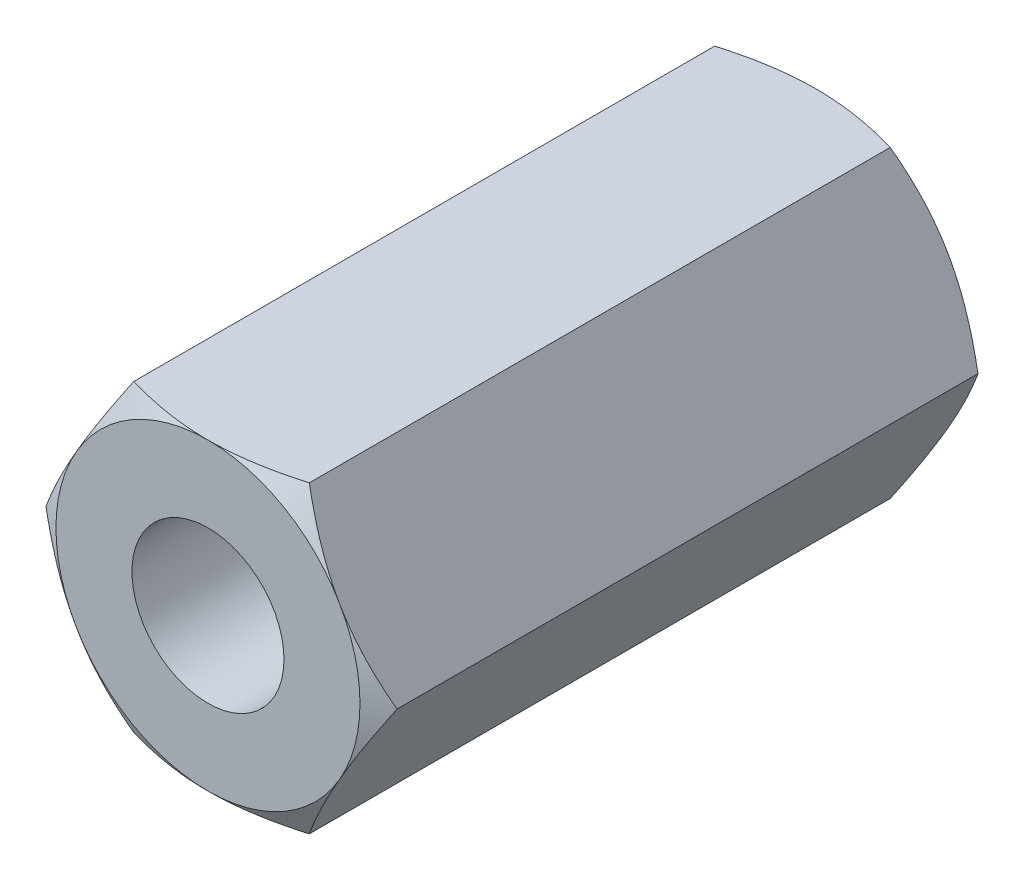
ISO-10303-21;
HEADER;
FILE_DESCRIPTION(('STEP AP214'),'2;1');
FILE_NAME('part.step','',(''),(''),'','','');
FILE_SCHEMA(('AUTOMOTIVE_DESIGN { 1 0 10303 214 1 1 1 1 }'));
ENDSEC;
DATA;
#1=APPLICATION_CONTEXT('core data for automotive mechanical design processes');
#2=APPLICATION_PROTOCOL_DEFINITION('international standard','automotive_design',2000,#1);
#3=PRODUCT_CONTEXT('',#1,'mechanical');
#4=PRODUCT('Part','Part','',(#3));
#5=PRODUCT_RELATED_PRODUCT_CATEGORY('part','',(#4));
#6=PRODUCT_DEFINITION_FORMATION('','',#4);
#7=PRODUCT_DEFINITION_CONTEXT('part definition',#1,'design');
#8=PRODUCT_DEFINITION('design','',#6,#7);
#9=PRODUCT_DEFINITION_SHAPE('','',#8);
#10=(LENGTH_UNIT() NAMED_UNIT(*) SI_UNIT(.MILLI.,.METRE.));
#11=(NAMED_UNIT(*) PLANE_ANGLE_UNIT() SI_UNIT($,.RADIAN.));
#12=(NAMED_UNIT(*) SI_UNIT($,.STERADIAN.) SOLID_ANGLE_UNIT());
#13=UNCERTAINTY_MEASURE_WITH_UNIT(LENGTH_MEASURE(1.E-05),#10,'distance_accuracy_value','');
#14=(GEOMETRIC_REPRESENTATION_CONTEXT(3) GLOBAL_UNCERTAINTY_ASSIGNED_CONTEXT((#13)) GLOBAL_UNIT_ASSIGNED_CONTEXT((#10,
#11,#12)) REPRESENTATION_CONTEXT('',''));
#15=CARTESIAN_POINT('',(0.,0.,0.));
#16=DIRECTION('',(0.,0.,1.));
#17=DIRECTION('',(1.,0.,0.));
#18=AXIS2_PLACEMENT_3D('',#15,#16,#17);
#19=CARTESIAN_POINT('',(0.,0.,5.56698729810778));
#20=DIRECTION('',(0.,0.,-1.));
#21=DIRECTION('',(0.,1.,0.));
#22=AXIS2_PLACEMENT_3D('',#19,#20,#21);
#23=CONICAL_SURFACE('',#22,3.75,1.0471975511966);
#24=CARTESIAN_POINT('',(-4.61658816560313,-3.,4.55332536641132));
#25=CARTESIAN_POINT('',(-4.48585639553745,-3.,4.61659673599052));
#26=CARTESIAN_POINT('',(-4.35482063299639,-3.,4.67925095047082));
#27=CARTESIAN_POINT('',(-4.09197932362654,-3.,4.80297722697862));
#28=CARTESIAN_POINT('',(-3.96017365610342,-3.,4.86404903231273));
#29=CARTESIAN_POINT('',(-3.69493421662757,-3.,4.98457763911744));
#30=CARTESIAN_POINT('',(-3.56149546306723,-3.,5.04402351646837));
#31=CARTESIAN_POINT('',(-3.29354397999658,-3.,5.16043407504241));
#32=CARTESIAN_POINT('',(-3.15903130268234,-3.,5.21739887599533));
#33=CARTESIAN_POINT('',(-2.88451486663867,-3.,5.32991377331616));
#34=CARTESIAN_POINT('',(-2.74447033709531,-3.,5.38536494839728));
#35=CARTESIAN_POINT('',(-2.46272959449536,-3.,5.49198287179878));
#36=CARTESIAN_POINT('',(-2.32103319621333,-3.,5.54314913428037));
#37=CARTESIAN_POINT('',(-2.03604039609872,-3.,5.63982761977302));
#38=CARTESIAN_POINT('',(-1.89274802630187,-3.,5.68535160726105));
#39=CARTESIAN_POINT('',(-1.60410836835444,-3.,5.76926106967255));
#40=CARTESIAN_POINT('',(-1.45876175465369,-3.,5.8076488315534));
#41=CARTESIAN_POINT('',(-1.16673215848061,-3.,5.8752176455911));
#42=CARTESIAN_POINT('',(-1.0200606408196,-3.,5.90444732518244));
#43=CARTESIAN_POINT('',(-0.724931883390046,-3.,5.95202353955565));
#44=CARTESIAN_POINT('',(-0.576474802153951,-3.,5.97037103334759));
#45=CARTESIAN_POINT('',(-0.280440052185822,-3.,5.99447833561648));
#46=CARTESIAN_POINT('',(-0.13287565270878,-3.,6.00039709755714));
#47=CARTESIAN_POINT('',(0.162228239904156,-3.,5.99956145014694));
#48=CARTESIAN_POINT('',(0.309767732325289,-3.,5.99280672401251));
#49=CARTESIAN_POINT('',(0.56132805962686,-3.,5.9709572819287));
#50=CARTESIAN_POINT('',(0.665621803419395,-3.,5.95883150506769));
#51=CARTESIAN_POINT('',(0.873419518980608,-3.,5.92902216036775));
#52=CARTESIAN_POINT('',(0.976923376822562,-3.,5.91133780576261));
#53=CARTESIAN_POINT('',(1.28611373532515,-3.,5.85087645938643));
#54=CARTESIAN_POINT('',(1.49035730083079,-3.,5.80070312750081));
#55=CARTESIAN_POINT('',(1.89902764143582,-3.,5.68479281504696));
#56=CARTESIAN_POINT('',(2.10336150492194,-3.,5.61874063547991));
#57=CARTESIAN_POINT('',(2.40703442855808,-3.,5.51188270244431));
#58=CARTESIAN_POINT('',(2.50777604457203,-3.,5.47497145514699));
#59=CARTESIAN_POINT('',(2.7084324429228,-3.,5.39896563915211));
#60=CARTESIAN_POINT('',(2.80834723318007,-3.,5.35987109139702));
#61=CARTESIAN_POINT('',(3.03652654486058,-3.,5.26818150264062));
#62=CARTESIAN_POINT('',(3.16454614650239,-3.,5.21497889029494));
#63=CARTESIAN_POINT('',(3.41955503261441,-3.,5.10615379179428));
#64=CARTESIAN_POINT('',(3.54654426752983,-3.,5.05053119006048));
#65=CARTESIAN_POINT('',(3.92625860423041,-3.,4.88075275505402));
#66=CARTESIAN_POINT('',(4.17768851165822,-3.,4.76370348434465));
#67=CARTESIAN_POINT('',(4.67831517527856,-3.,4.52440154372504));
#68=CARTESIAN_POINT('',(4.92750969345666,-3.,4.40214424003166));
#69=CARTESIAN_POINT('',(5.42413001849477,-3.,4.15407673717374));
#70=CARTESIAN_POINT('',(5.67155576558937,-3.,4.02826641866));
#71=CARTESIAN_POINT('',(6.14562883300115,-3.,3.78413020470005));
#72=CARTESIAN_POINT('',(6.37237560034691,-3.,3.66599677644138));
#73=CARTESIAN_POINT('',(6.8250176751701,-3.,3.42809509619585));
#74=CARTESIAN_POINT('',(7.05091295673014,-3.,3.30832679495165));
#75=CARTESIAN_POINT('',(7.50152538445931,-3.,3.06780728554477));
#76=CARTESIAN_POINT('',(7.72624403806943,-3.,2.94705889743176));
#77=CARTESIAN_POINT('',(8.17513206085804,-3.,2.70457171012414));
#78=CARTESIAN_POINT('',(8.39930145695651,-3.,2.58283296078537));
#79=CARTESIAN_POINT('',(8.62326645922438,-3.,2.46072192935785));
#80=B_SPLINE_CURVE_WITH_KNOTS('',3,(#24,#25,#26,#27,#28,#29,#30,#31,#32,#33,#34,#35,#36,#37,#38,
#39,#40,#41,#42,#43,#44,#45,#46,#47,#48,#49,#50,#51,#52,#53,#54,#55,#56,#57,#58,#59,#60,#61,#62,
#63,#64,#65,#66,#67,#68,#69,#70,#71,#72,#73,#74,#75,#76,#77,#78,#79),.UNSPECIFIED.,.F.,.F.,(4,2,
2,2,2,2,2,2,2,2,2,2,2,2,2,2,2,2,2,2,2,2,2,2,2,2,2,4),(0.,0.435719350665182,0.871508945355478,
1.30973230306221,1.74793448985021,2.19974947235604,2.65161561410331,3.10252314515071,
3.55328592310448,4.00161301376219,4.4499005890032,4.8924191110649,5.3349486943642,
5.64978531479406,5.96466651757124,6.59479413668654,7.2386470362871,7.56049974594028,
7.88234936887596,8.29822097415706,8.71411246333825,9.54603104088751,10.3787059339167,
11.2114088306492,11.9784254401204,12.7454652103875,13.5107780415065,14.2760525814872),.UNSPECIFIED.);
#81=CARTESIAN_POINT('',(1.73205080756888,-3.,5.73205080756888));
#82=VERTEX_POINT('',#81);
#83=CARTESIAN_POINT('',(0.,-3.,6.));
#84=VERTEX_POINT('',#83);
#85=EDGE_CURVE('E227',#82,#84,#80,.F.);
#86=ORIENTED_EDGE('',*,*,#85,.F.);
#87=CARTESIAN_POINT('',(3.46421708519159,0.00019999999999997,5.73198413756899));
#88=CARTESIAN_POINT('',(3.38810199317915,-0.131635206588332,5.77594629554769));
#89=CARTESIAN_POINT('',(3.31132988107606,-0.26460840535525,5.81592841370737));
#90=CARTESIAN_POINT('',(3.15645624025988,-0.532857420002056,5.88571791955453));
#91=CARTESIAN_POINT('',(3.078351959461,-0.668138002634342,5.91550061773462));
#92=CARTESIAN_POINT('',(2.92311136358059,-0.937022602096484,5.96186216078875));
#93=CARTESIAN_POINT('',(2.84599893549861,-1.07058524542946,5.97874955887705));
#94=CARTESIAN_POINT('',(2.6914112001411,-1.33833905729569,5.99891035755148));
#95=CARTESIAN_POINT('',(2.61393645482892,-1.47252925247984,6.00220045221892));
#96=CARTESIAN_POINT('',(2.46916798492017,-1.72327559769581,5.99535946911461));
#97=CARTESIAN_POINT('',(2.40185259973206,-1.83986926497268,5.98690808580738));
#98=CARTESIAN_POINT('',(2.2676603930218,-2.07229698497464,5.96012105699297));
#99=CARTESIAN_POINT('',(2.2007840357172,-2.18813023365133,5.94177625913829));
#100=CARTESIAN_POINT('',(2.06631510305815,-2.42103725705637,5.89591524914667));
#101=CARTESIAN_POINT('',(1.99873954872331,-2.53808155051394,5.86820461473692));
#102=CARTESIAN_POINT('',(1.86459637060759,-2.77042435049912,5.8053122048626));
#103=CARTESIAN_POINT('',(1.79802702797161,-2.88572583417111,5.77014520897844));
#104=CARTESIAN_POINT('',(1.73193533751504,-3.0002,5.73198413756899));
#105=B_SPLINE_CURVE_WITH_KNOTS('',3,(#87,#88,#89,#90,#91,#92,#93,#94,#95,#96,#97,#98,#99,#100,
#101,#102,#103,#104),.UNSPECIFIED.,.F.,.F.,(4,2,2,2,2,2,2,2,4),(0.,0.475539830103042,
0.952222784107966,1.41710776961288,1.88142182298026,2.28572436316091,2.69040156475039,
3.10405572063576,3.5168974940707),.UNSPECIFIED.);
#106=CARTESIAN_POINT('',(2.59807621135332,-1.5,6.));
#107=VERTEX_POINT('',#106);
#108=EDGE_CURVE('E156',#107,#82,#105,.T.);
#109=ORIENTED_EDGE('',*,*,#108,.F.);
#110=CARTESIAN_POINT('',(0.,0.,6.));
#111=DIRECTION('',(0.,0.,1.));
#112=DIRECTION('',(0.,-1.,0.));
#113=AXIS2_PLACEMENT_3D('',#110,#111,#112);
#114=CIRCLE('',#113,3.);
#115=EDGE_CURVE('E12',#84,#107,#114,.T.);
#116=ORIENTED_EDGE('',*,*,#115,.F.);
#117=EDGE_LOOP('',(#86,#109,#116));
#118=FACE_BOUND('',#117,.T.);
#119=ADVANCED_FACE('F37',(#118),#23,.T.);
#120=CARTESIAN_POINT('',(-1.73205080756888,-3.,5.73205080756888));
#121=VERTEX_POINT('',#120);
#122=EDGE_CURVE('E232',#84,#121,#80,.F.);
#123=ORIENTED_EDGE('',*,*,#122,.F.);
#124=CARTESIAN_POINT('',(-2.59807621135332,-1.5,6.));
#125=VERTEX_POINT('',#124);
#126=EDGE_CURVE('E46',#125,#84,#114,.T.);
#127=ORIENTED_EDGE('',*,*,#126,.F.);
#128=CARTESIAN_POINT('',(-1.73193533751504,-3.0002,5.73198413756899));
#129=CARTESIAN_POINT('',(-1.80805042952748,-2.86836479341167,5.77594629554769));
#130=CARTESIAN_POINT('',(-1.88482254163057,-2.73539159464475,5.81592841370737));
#131=CARTESIAN_POINT('',(-2.03969618244675,-2.46714257999794,5.88571791955454));
#132=CARTESIAN_POINT('',(-2.11780046324563,-2.33186199736566,5.91550061773462));
#133=CARTESIAN_POINT('',(-2.27304105912605,-2.06297739790352,5.96186216078874));
#134=CARTESIAN_POINT('',(-2.35015348720802,-1.92941475457054,5.97874955887705));
#135=CARTESIAN_POINT('',(-2.50474122256554,-1.66166094270431,5.99891035755148));
#136=CARTESIAN_POINT('',(-2.58221596787771,-1.52747074752016,6.00220045221892));
#137=CARTESIAN_POINT('',(-2.72698443778647,-1.27672440230419,5.99535946911461));
#138=CARTESIAN_POINT('',(-2.79429982297457,-1.16013073502732,5.98690808580738));
#139=CARTESIAN_POINT('',(-2.92849202968483,-0.927703015025363,5.96012105699297));
#140=CARTESIAN_POINT('',(-2.99536838698943,-0.811869766348668,5.94177625913829));
#141=CARTESIAN_POINT('',(-3.12983731964848,-0.578962742943632,5.89591524914667));
#142=CARTESIAN_POINT('',(-3.19741287398332,-0.461918449486059,5.86820461473692));
#143=CARTESIAN_POINT('',(-3.33155605209904,-0.229575649500875,5.8053122048626));
#144=CARTESIAN_POINT('',(-3.39812539473502,-0.114274165828894,5.77014520897844));
#145=CARTESIAN_POINT('',(-3.46421708519159,0.000199999999999855,5.73198413756899));
#146=B_SPLINE_CURVE_WITH_KNOTS('',3,(#128,#129,#130,#131,#132,#133,#134,#135,#136,#137,#138,
#139,#140,#141,#142,#143,#144,#145),.UNSPECIFIED.,.F.,.F.,(4,2,2,2,2,2,2,2,4),(0.,
0.475539830103041,0.952222784107965,1.41710776961288,1.88142182298026,2.28572436316091,
2.69040156475039,3.10405572063576,3.5168974940707),.UNSPECIFIED.);
#147=EDGE_CURVE('E273',#121,#125,#146,.T.);
#148=ORIENTED_EDGE('',*,*,#147,.F.);
#149=EDGE_LOOP('',(#123,#127,#148));
#150=FACE_BOUND('',#149,.T.);
#151=ADVANCED_FACE('F248',(#150),#23,.T.);
#152=CARTESIAN_POINT('',(-3.46410161513775,0.,5.73205080756888));
#153=VERTEX_POINT('',#152);
#154=EDGE_CURVE('E268',#125,#153,#146,.T.);
#155=ORIENTED_EDGE('',*,*,#154,.F.);
#156=CARTESIAN_POINT('',(-2.59807621135332,1.5,6.));
#157=VERTEX_POINT('',#156);
#158=EDGE_CURVE('E223',#157,#125,#114,.T.);
#159=ORIENTED_EDGE('',*,*,#158,.F.);
#160=CARTESIAN_POINT('',(-3.46421708519159,-0.0002,5.73198413756899));
#161=CARTESIAN_POINT('',(-3.38810199317915,0.131635206588332,5.77594629554769));
#162=CARTESIAN_POINT('',(-3.31132988107606,0.26460840535525,5.81592841370737));
#163=CARTESIAN_POINT('',(-3.15645624025988,0.532857420002056,5.88571791955453));
#164=CARTESIAN_POINT('',(-3.078351959461,0.668138002634342,5.91550061773462));
#165=CARTESIAN_POINT('',(-2.92311136358059,0.937022602096484,5.96186216078875));
#166=CARTESIAN_POINT('',(-2.84599893549861,1.07058524542946,5.97874955887705));
#167=CARTESIAN_POINT('',(-2.6914112001411,1.33833905729569,5.99891035755148));
#168=CARTESIAN_POINT('',(-2.61393645482892,1.47252925247984,6.00220045221892));
#169=CARTESIAN_POINT('',(-2.46916798492017,1.72327559769581,5.99535946911461));
#170=CARTESIAN_POINT('',(-2.40185259973206,1.83986926497268,5.98690808580738));
#171=CARTESIAN_POINT('',(-2.2676603930218,2.07229698497464,5.96012105699297));
#172=CARTESIAN_POINT('',(-2.2007840357172,2.18813023365133,5.94177625913829));
#173=CARTESIAN_POINT('',(-2.06631510305815,2.42103725705637,5.89591524914667));
#174=CARTESIAN_POINT('',(-1.99873954872331,2.53808155051394,5.86820461473692));
#175=CARTESIAN_POINT('',(-1.86459637060759,2.77042435049913,5.8053122048626));
#176=CARTESIAN_POINT('',(-1.79802702797161,2.88572583417111,5.77014520897844));
#177=CARTESIAN_POINT('',(-1.73193533751504,3.0002,5.73198413756899));
#178=B_SPLINE_CURVE_WITH_KNOTS('',3,(#160,#161,#162,#163,#164,#165,#166,#167,#168,#169,#170,
#171,#172,#173,#174,#175,#176,#177),.UNSPECIFIED.,.F.,.F.,(4,2,2,2,2,2,2,2,4),(0.,
0.475539830103041,0.952222784107965,1.41710776961288,1.88142182298026,2.28572436316091,
2.69040156475039,3.10405572063576,3.5168974940707),.UNSPECIFIED.);
#179=EDGE_CURVE('E334',#153,#157,#178,.T.);
#180=ORIENTED_EDGE('',*,*,#179,.F.);
#181=EDGE_LOOP('',(#155,#159,#180));
#182=FACE_BOUND('',#181,.T.);
#183=ADVANCED_FACE('F333',(#182),#23,.T.);
#184=CARTESIAN_POINT('',(-1.73205080756888,3.,5.73205080756888));
#185=VERTEX_POINT('',#184);
#186=EDGE_CURVE('E263',#157,#185,#178,.T.);
#187=ORIENTED_EDGE('',*,*,#186,.F.);
#188=CARTESIAN_POINT('',(0.,3.,6.));
#189=VERTEX_POINT('',#188);
#190=EDGE_CURVE('E322',#189,#157,#114,.T.);
#191=ORIENTED_EDGE('',*,*,#190,.F.);
#192=CARTESIAN_POINT('',(-4.61658816560314,3.,4.55332536641131));
#193=CARTESIAN_POINT('',(-4.48585639553746,3.,4.61659673599051));
#194=CARTESIAN_POINT('',(-4.3548206329964,3.,4.67925095047082));
#195=CARTESIAN_POINT('',(-4.09197932362655,3.,4.80297722697862));
#196=CARTESIAN_POINT('',(-3.96017365610343,3.,4.86404903231273));
#197=CARTESIAN_POINT('',(-3.69493421662757,3.,4.98457763911744));
#198=CARTESIAN_POINT('',(-3.56149546306723,3.,5.04402351646837));
#199=CARTESIAN_POINT('',(-3.29354397999658,3.,5.16043407504241));
#200=CARTESIAN_POINT('',(-3.15903130268234,3.,5.21739887599533));
#201=CARTESIAN_POINT('',(-2.88451486663867,3.,5.32991377331615));
#202=CARTESIAN_POINT('',(-2.74447033709531,3.,5.38536494839728));
#203=CARTESIAN_POINT('',(-2.46272959449536,3.,5.49198287179878));
#204=CARTESIAN_POINT('',(-2.32103319621333,3.,5.54314913428037));
#205=CARTESIAN_POINT('',(-2.03604039609872,3.,5.63982761977302));
#206=CARTESIAN_POINT('',(-1.89274802630187,3.,5.68535160726105));
#207=CARTESIAN_POINT('',(-1.60410836835444,3.,5.76926106967255));
#208=CARTESIAN_POINT('',(-1.45876175465369,3.,5.8076488315534));
#209=CARTESIAN_POINT('',(-1.16673215848061,3.,5.8752176455911));
#210=CARTESIAN_POINT('',(-1.0200606408196,3.,5.90444732518244));
#211=CARTESIAN_POINT('',(-0.724931883390045,3.,5.95202353955565));
#212=CARTESIAN_POINT('',(-0.576474802153949,3.,5.97037103334759));
#213=CARTESIAN_POINT('',(-0.28044005218582,3.,5.99447833561648));
#214=CARTESIAN_POINT('',(-0.132875652708778,3.,6.00039709755714));
#215=CARTESIAN_POINT('',(0.162228239904158,3.,5.99956145014694));
#216=CARTESIAN_POINT('',(0.309767732325292,3.,5.99280672401251));
#217=CARTESIAN_POINT('',(0.561328059626863,3.,5.97095728192869));
#218=CARTESIAN_POINT('',(0.665621803419398,3.,5.95883150506769));
#219=CARTESIAN_POINT('',(0.873419518980611,3.,5.92902216036775));
#220=CARTESIAN_POINT('',(0.976923376822566,3.,5.9113378057626));
#221=CARTESIAN_POINT('',(1.28611373532515,3.,5.85087645938643));
#222=CARTESIAN_POINT('',(1.49035730083079,3.,5.80070312750081));
#223=CARTESIAN_POINT('',(1.89902764143583,3.,5.68479281504695));
#224=CARTESIAN_POINT('',(2.10336150492195,3.,5.6187406354799));
#225=CARTESIAN_POINT('',(2.40703442855809,3.,5.5118827024443));
#226=CARTESIAN_POINT('',(2.50777604457204,3.,5.47497145514699));
#227=CARTESIAN_POINT('',(2.70843244292281,3.,5.39896563915211));
#228=CARTESIAN_POINT('',(2.80834723318008,3.,5.35987109139702));
#229=CARTESIAN_POINT('',(3.03652654486058,3.,5.26818150264061));
#230=CARTESIAN_POINT('',(3.16454614650239,3.,5.21497889029493));
#231=CARTESIAN_POINT('',(3.41955503261442,3.,5.10615379179428));
#232=CARTESIAN_POINT('',(3.54654426752983,3.,5.05053119006048));
#233=CARTESIAN_POINT('',(3.92625860423042,3.,4.88075275505402));
#234=CARTESIAN_POINT('',(4.17768851165823,3.,4.76370348434465));
#235=CARTESIAN_POINT('',(4.67831517527857,3.,4.52440154372503));
#236=CARTESIAN_POINT('',(4.92750969345666,3.,4.40214424003165));
#237=CARTESIAN_POINT('',(5.42413001849477,3.,4.15407673717374));
#238=CARTESIAN_POINT('',(5.67155576558938,3.,4.02826641865999));
#239=CARTESIAN_POINT('',(6.14562883300116,3.,3.78413020470004));
#240=CARTESIAN_POINT('',(6.37237560034691,3.,3.66599677644137));
#241=CARTESIAN_POINT('',(6.8250176751701,3.,3.42809509619585));
#242=CARTESIAN_POINT('',(7.05091295673015,3.,3.30832679495164));
#243=CARTESIAN_POINT('',(7.50152538445932,3.,3.06780728554477));
#244=CARTESIAN_POINT('',(7.72624403806943,3.,2.94705889743175));
#245=CARTESIAN_POINT('',(8.17513206085804,3.,2.70457171012414));
#246=CARTESIAN_POINT('',(8.39930145695651,3.,2.58283296078537));
#247=CARTESIAN_POINT('',(8.62326645922439,3.,2.46072192935785));
#248=B_SPLINE_CURVE_WITH_KNOTS('',3,(#192,#193,#194,#195,#196,#197,#198,#199,#200,#201,#202,
#203,#204,#205,#206,#207,#208,#209,#210,#211,#212,#213,#214,#215,#216,#217,#218,#219,#220,#221,
#222,#223,#224,#225,#226,#227,#228,#229,#230,#231,#232,#233,#234,#235,#236,#237,#238,#239,#240,
#241,#242,#243,#244,#245,#246,#247),.UNSPECIFIED.,.F.,.F.,(4,2,2,2,2,2,2,2,2,2,2,2,2,2,2,2,2,2,
2,2,2,2,2,2,2,2,2,4),(0.,0.435719350665182,0.871508945355478,1.30973230306221,1.74793448985021,
2.19974947235604,2.65161561410331,3.10252314515072,3.55328592310448,4.00161301376219,
4.4499005890032,4.8924191110649,5.33494869436421,5.64978531479407,5.96466651757125,
6.59479413668655,7.23864703628711,7.56049974594029,7.88234936887598,8.29822097415707,
8.71411246333826,9.54603104088752,10.3787059339167,11.2114088306492,11.9784254401204,
12.7454652103875,13.5107780415065,14.2760525814872),.UNSPECIFIED.);
#249=EDGE_CURVE('E295',#185,#189,#248,.T.);
#250=ORIENTED_EDGE('',*,*,#249,.F.);
#251=EDGE_LOOP('',(#187,#191,#250));
#252=FACE_BOUND('',#251,.T.);
#253=ADVANCED_FACE('F337',(#252),#23,.T.);
#254=CARTESIAN_POINT('',(1.73205080756888,3.,5.73205080756888));
#255=VERTEX_POINT('',#254);
#256=EDGE_CURVE('E257',#189,#255,#248,.T.);
#257=ORIENTED_EDGE('',*,*,#256,.F.);
#258=CARTESIAN_POINT('',(2.59807621135332,1.5,6.));
#259=VERTEX_POINT('',#258);
#260=EDGE_CURVE('E317',#259,#189,#114,.T.);
#261=ORIENTED_EDGE('',*,*,#260,.F.);
#262=CARTESIAN_POINT('',(1.73193533751504,3.0002,5.73198413756899));
#263=CARTESIAN_POINT('',(1.80805042952748,2.86836479341167,5.77594629554769));
#264=CARTESIAN_POINT('',(1.88482254163057,2.73539159464475,5.81592841370737));
#265=CARTESIAN_POINT('',(2.03969618244675,2.46714257999794,5.88571791955453));
#266=CARTESIAN_POINT('',(2.11780046324563,2.33186199736566,5.91550061773462));
#267=CARTESIAN_POINT('',(2.27304105912605,2.06297739790352,5.96186216078874));
#268=CARTESIAN_POINT('',(2.35015348720802,1.92941475457054,5.97874955887705));
#269=CARTESIAN_POINT('',(2.50474122256554,1.66166094270431,5.99891035755148));
#270=CARTESIAN_POINT('',(2.58221596787771,1.52747074752016,6.00220045221892));
#271=CARTESIAN_POINT('',(2.72698443778647,1.27672440230419,5.99535946911461));
#272=CARTESIAN_POINT('',(2.79429982297457,1.16013073502732,5.98690808580738));
#273=CARTESIAN_POINT('',(2.92849202968483,0.927703015025362,5.96012105699297));
#274=CARTESIAN_POINT('',(2.99536838698943,0.811869766348667,5.94177625913829));
#275=CARTESIAN_POINT('',(3.12983731964849,0.578962742943631,5.89591524914667));
#276=CARTESIAN_POINT('',(3.19741287398332,0.461918449486059,5.86820461473692));
#277=CARTESIAN_POINT('',(3.33155605209904,0.229575649500875,5.8053122048626));
#278=CARTESIAN_POINT('',(3.39812539473502,0.114274165828893,5.77014520897844));
#279=CARTESIAN_POINT('',(3.46421708519159,-0.000200000000000225,5.73198413756899));
#280=B_SPLINE_CURVE_WITH_KNOTS('',3,(#262,#263,#264,#265,#266,#267,#268,#269,#270,#271,#272,
#273,#274,#275,#276,#277,#278,#279),.UNSPECIFIED.,.F.,.F.,(4,2,2,2,2,2,2,2,4),(0.,
0.475539830103041,0.952222784107966,1.41710776961288,1.88142182298026,2.28572436316091,
2.69040156475039,3.10405572063576,3.5168974940707),.UNSPECIFIED.);
#281=EDGE_CURVE('E148',#255,#259,#280,.T.);
#282=ORIENTED_EDGE('',*,*,#281,.F.);
#283=EDGE_LOOP('',(#257,#261,#282));
#284=FACE_BOUND('',#283,.T.);
#285=ADVANCED_FACE('F318',(#284),#23,.T.);
#286=CARTESIAN_POINT('',(3.46410161513775,0.,5.73205080756888));
#287=VERTEX_POINT('',#286);
#288=EDGE_CURVE('E140',#259,#287,#280,.T.);
#289=ORIENTED_EDGE('',*,*,#288,.F.);
#290=EDGE_CURVE('E45',#107,#259,#114,.T.);
#291=ORIENTED_EDGE('',*,*,#290,.F.);
#292=EDGE_CURVE('E53',#287,#107,#105,.T.);
#293=ORIENTED_EDGE('',*,*,#292,.F.);
#294=EDGE_LOOP('',(#289,#291,#293));
#295=FACE_BOUND('',#294,.T.);
#296=ADVANCED_FACE('F250',(#295),#23,.T.);
#297=CARTESIAN_POINT('',(0.,0.,6.));
#298=DIRECTION('',(0.,0.,-1.));
#299=DIRECTION('',(0.,1.,0.));
#300=AXIS2_PLACEMENT_3D('',#297,#298,#299);
#301=PLANE('',#300);
#302=CARTESIAN_POINT('',(0.,0.,6.));
#303=DIRECTION('',(0.,0.,1.));
#304=DIRECTION('',(1.,0.,0.));
#305=AXIS2_PLACEMENT_3D('',#302,#303,#304);
#306=CIRCLE('',#305,1.5);
#307=CARTESIAN_POINT('',(1.5,0.,6.));
#308=VERTEX_POINT('',#307);
#309=EDGE_CURVE('E187',#308,#308,#306,.T.);
#310=ORIENTED_EDGE('',*,*,#309,.F.);
#311=EDGE_LOOP('',(#310));
#312=FACE_BOUND('',#311,.T.);
#313=ORIENTED_EDGE('',*,*,#115,.T.);
#314=ORIENTED_EDGE('',*,*,#290,.T.);
#315=ORIENTED_EDGE('',*,*,#260,.T.);
#316=ORIENTED_EDGE('',*,*,#190,.T.);
#317=ORIENTED_EDGE('',*,*,#158,.T.);
#318=ORIENTED_EDGE('',*,*,#126,.T.);
#319=EDGE_LOOP('',(#313,#314,#315,#316,#317,#318));
#320=FACE_BOUND('',#319,.T.);
#321=ADVANCED_FACE('F39',(#312,#320),#301,.F.);
#322=CARTESIAN_POINT('',(-1.73205080756888,-3.,-6.));
#323=DIRECTION('',(0.,-1.,0.));
#324=DIRECTION('',(1.,0.,0.));
#325=AXIS2_PLACEMENT_3D('',#322,#323,#324);
#326=PLANE('',#325);
#327=ORIENTED_EDGE('',*,*,#85,.T.);
#328=ORIENTED_EDGE('',*,*,#122,.T.);
#329=DIRECTION('',(0.,0.,1.));
#330=VECTOR('',#329,1.);
#331=CARTESIAN_POINT('',(-1.73205080756888,-3.,-6.));
#332=LINE('',#331,#330);
#333=CARTESIAN_POINT('',(-1.73205080756888,-3.,-5.73205080756888));
#334=VERTEX_POINT('',#333);
#335=EDGE_CURVE('E133',#334,#121,#332,.T.);
#336=ORIENTED_EDGE('',*,*,#335,.F.);
#337=CARTESIAN_POINT('',(-4.61658816560313,-3.,-4.55332536641132));
#338=CARTESIAN_POINT('',(-4.48585639553745,-3.,-4.61659673599052));
#339=CARTESIAN_POINT('',(-4.35482063299639,-3.,-4.67925095047082));
#340=CARTESIAN_POINT('',(-4.09197932362654,-3.,-4.80297722697862));
#341=CARTESIAN_POINT('',(-3.96017365610342,-3.,-4.86404903231273));
#342=CARTESIAN_POINT('',(-3.69493421662757,-3.,-4.98457763911744));
#343=CARTESIAN_POINT('',(-3.56149546306723,-3.,-5.04402351646837));
#344=CARTESIAN_POINT('',(-3.29354397999658,-3.,-5.16043407504241));
#345=CARTESIAN_POINT('',(-3.15903130268234,-3.,-5.21739887599533));
#346=CARTESIAN_POINT('',(-2.88451486663867,-3.,-5.32991377331616));
#347=CARTESIAN_POINT('',(-2.74447033709531,-3.,-5.38536494839729));
#348=CARTESIAN_POINT('',(-2.46272959449536,-3.,-5.49198287179878));
#349=CARTESIAN_POINT('',(-2.32103319621333,-3.,-5.54314913428037));
#350=CARTESIAN_POINT('',(-2.03604039609872,-3.,-5.63982761977302));
#351=CARTESIAN_POINT('',(-1.89274802630187,-3.,-5.68535160726105));
#352=CARTESIAN_POINT('',(-1.60410836835444,-3.,-5.76926106967255));
#353=CARTESIAN_POINT('',(-1.4587617546537,-3.,-5.8076488315534));
#354=CARTESIAN_POINT('',(-1.16673215848061,-3.,-5.8752176455911));
#355=CARTESIAN_POINT('',(-1.0200606408196,-3.,-5.90444732518244));
#356=CARTESIAN_POINT('',(-0.724931883390046,-3.,-5.95202353955565));
#357=CARTESIAN_POINT('',(-0.57647480215395,-3.,-5.97037103334759));
#358=CARTESIAN_POINT('',(-0.280440052185821,-3.,-5.99447833561648));
#359=CARTESIAN_POINT('',(-0.132875652708779,-3.,-6.00039709755714));
#360=CARTESIAN_POINT('',(0.162228239904156,-3.,-5.99956145014694));
#361=CARTESIAN_POINT('',(0.30976773232529,-3.,-5.99280672401251));
#362=CARTESIAN_POINT('',(0.561328059626861,-3.,-5.9709572819287));
#363=CARTESIAN_POINT('',(0.665621803419396,-3.,-5.95883150506769));
#364=CARTESIAN_POINT('',(0.873419518980609,-3.,-5.92902216036775));
#365=CARTESIAN_POINT('',(0.976923376822564,-3.,-5.91133780576261));
#366=CARTESIAN_POINT('',(1.28611373532515,-3.,-5.85087645938643));
#367=CARTESIAN_POINT('',(1.49035730083079,-3.,-5.80070312750081));
#368=CARTESIAN_POINT('',(1.89902764143583,-3.,-5.68479281504696));
#369=CARTESIAN_POINT('',(2.10336150492195,-3.,-5.61874063547991));
#370=CARTESIAN_POINT('',(2.40703442855808,-3.,-5.51188270244431));
#371=CARTESIAN_POINT('',(2.50777604457204,-3.,-5.47497145514699));
#372=CARTESIAN_POINT('',(2.70843244292281,-3.,-5.39896563915211));
#373=CARTESIAN_POINT('',(2.80834723318008,-3.,-5.35987109139702));
#374=CARTESIAN_POINT('',(3.03652654486058,-3.,-5.26818150264062));
#375=CARTESIAN_POINT('',(3.16454614650239,-3.,-5.21497889029494));
#376=CARTESIAN_POINT('',(3.41955503261442,-3.,-5.10615379179428));
#377=CARTESIAN_POINT('',(3.54654426752983,-3.,-5.05053119006048));
#378=CARTESIAN_POINT('',(3.92625860423042,-3.,-4.88075275505402));
#379=CARTESIAN_POINT('',(4.17768851165823,-3.,-4.76370348434465));
#380=CARTESIAN_POINT('',(4.67831517527857,-3.,-4.52440154372503));
#381=CARTESIAN_POINT('',(4.92750969345667,-3.,-4.40214424003165));
#382=CARTESIAN_POINT('',(5.42413001849478,-3.,-4.15407673717374));
#383=CARTESIAN_POINT('',(5.67155576558938,-3.,-4.02826641865999));
#384=CARTESIAN_POINT('',(6.14562883300116,-3.,-3.78413020470004));
#385=CARTESIAN_POINT('',(6.37237560034692,-3.,-3.66599677644138));
#386=CARTESIAN_POINT('',(6.82501767517011,-3.,-3.42809509619585));
#387=CARTESIAN_POINT('',(7.05091295673015,-3.,-3.30832679495164));
#388=CARTESIAN_POINT('',(7.50152538445932,-3.,-3.06780728554477));
#389=CARTESIAN_POINT('',(7.72624403806944,-3.,-2.94705889743176));
#390=CARTESIAN_POINT('',(8.17513206085805,-3.,-2.70457171012415));
#391=CARTESIAN_POINT('',(8.39930145695651,-3.,-2.58283296078537));
#392=CARTESIAN_POINT('',(8.62326645922439,-3.,-2.46072192935786));
#393=B_SPLINE_CURVE_WITH_KNOTS('',3,(#337,#338,#339,#340,#341,#342,#343,#344,#345,#346,#347,
#348,#349,#350,#351,#352,#353,#354,#355,#356,#357,#358,#359,#360,#361,#362,#363,#364,#365,#366,
#367,#368,#369,#370,#371,#372,#373,#374,#375,#376,#377,#378,#379,#380,#381,#382,#383,#384,#385,
#386,#387,#388,#389,#390,#391,#392),.UNSPECIFIED.,.F.,.F.,(4,2,2,2,2,2,2,2,2,2,2,2,2,2,2,2,2,2,
2,2,2,2,2,2,2,2,2,4),(0.,0.435719350665183,0.871508945355478,1.30973230306221,1.74793448985021,
2.19974947235604,2.65161561410331,3.10252314515071,3.55328592310448,4.00161301376219,
4.4499005890032,4.8924191110649,5.3349486943642,5.64978531479407,5.96466651757124,
6.59479413668654,7.2386470362871,7.56049974594029,7.88234936887597,8.29822097415706,
8.71411246333825,9.54603104088751,10.3787059339167,11.2114088306492,11.9784254401204,
12.7454652103875,13.5107780415065,14.2760525814872),.UNSPECIFIED.);
#394=CARTESIAN_POINT('',(0.,-3.,-6.));
#395=VERTEX_POINT('',#394);
#396=EDGE_CURVE('E236',#334,#395,#393,.T.);
#397=ORIENTED_EDGE('',*,*,#396,.T.);
#398=CARTESIAN_POINT('',(1.73205080756888,-3.,-5.73205080756888));
#399=VERTEX_POINT('',#398);
#400=EDGE_CURVE('E241',#395,#399,#393,.T.);
#401=ORIENTED_EDGE('',*,*,#400,.T.);
#402=DIRECTION('',(0.,0.,1.));
#403=VECTOR('',#402,1.);
#404=CARTESIAN_POINT('',(1.73205080756888,-3.,-6.));
#405=LINE('',#404,#403);
#406=EDGE_CURVE('E142',#399,#82,#405,.T.);
#407=ORIENTED_EDGE('',*,*,#406,.T.);
#408=EDGE_LOOP('',(#327,#328,#336,#397,#401,#407));
#409=FACE_BOUND('',#408,.T.);
#410=ADVANCED_FACE('F179',(#409),#326,.T.);
#411=CARTESIAN_POINT('',(-3.46410161513775,0.,-6.));
#412=DIRECTION('',(-0.866025403784439,-0.5,0.));
#413=DIRECTION('',(0.5,-0.866025403784439,0.));
#414=AXIS2_PLACEMENT_3D('',#411,#412,#413);
#415=PLANE('',#414);
#416=ORIENTED_EDGE('',*,*,#147,.T.);
#417=ORIENTED_EDGE('',*,*,#154,.T.);
#418=DIRECTION('',(0.,0.,1.));
#419=VECTOR('',#418,1.);
#420=CARTESIAN_POINT('',(-3.46410161513775,0.,-6.));
#421=LINE('',#420,#419);
#422=CARTESIAN_POINT('',(-3.46410161513775,0.,-5.73205080756888));
#423=VERTEX_POINT('',#422);
#424=EDGE_CURVE('E194',#423,#153,#421,.T.);
#425=ORIENTED_EDGE('',*,*,#424,.F.);
#426=CARTESIAN_POINT('',(-3.46421708519159,0.000200000000000017,-5.73198413756899));
#427=CARTESIAN_POINT('',(-3.38810199317915,-0.131635206588332,-5.77594629554769));
#428=CARTESIAN_POINT('',(-3.31132988107606,-0.26460840535525,-5.81592841370737));
#429=CARTESIAN_POINT('',(-3.15645624025988,-0.532857420002056,-5.88571791955453));
#430=CARTESIAN_POINT('',(-3.078351959461,-0.668138002634342,-5.91550061773462));
#431=CARTESIAN_POINT('',(-2.92311136358059,-0.937022602096484,-5.96186216078875));
#432=CARTESIAN_POINT('',(-2.84599893549861,-1.07058524542946,-5.97874955887705));
#433=CARTESIAN_POINT('',(-2.6914112001411,-1.33833905729569,-5.99891035755148));
#434=CARTESIAN_POINT('',(-2.61393645482892,-1.47252925247984,-6.00220045221892));
#435=CARTESIAN_POINT('',(-2.46916798492017,-1.72327559769581,-5.99535946911461));
#436=CARTESIAN_POINT('',(-2.40185259973206,-1.83986926497268,-5.98690808580738));
#437=CARTESIAN_POINT('',(-2.2676603930218,-2.07229698497464,-5.96012105699297));
#438=CARTESIAN_POINT('',(-2.2007840357172,-2.18813023365133,-5.94177625913829));
#439=CARTESIAN_POINT('',(-2.06631510305815,-2.42103725705637,-5.89591524914667));
#440=CARTESIAN_POINT('',(-1.99873954872331,-2.53808155051394,-5.86820461473692));
#441=CARTESIAN_POINT('',(-1.86459637060759,-2.77042435049913,-5.8053122048626));
#442=CARTESIAN_POINT('',(-1.79802702797161,-2.88572583417111,-5.77014520897844));
#443=CARTESIAN_POINT('',(-1.73193533751504,-3.0002,-5.73198413756899));
#444=B_SPLINE_CURVE_WITH_KNOTS('',3,(#426,#427,#428,#429,#430,#431,#432,#433,#434,#435,#436,
#437,#438,#439,#440,#441,#442,#443),.UNSPECIFIED.,.F.,.F.,(4,2,2,2,2,2,2,2,4),(0.,
0.475539830103041,0.952222784107965,1.41710776961288,1.88142182298026,2.28572436316091,
2.69040156475039,3.10405572063576,3.5168974940707),.UNSPECIFIED.);
#445=CARTESIAN_POINT('',(-2.59807621135332,-1.5,-6.));
#446=VERTEX_POINT('',#445);
#447=EDGE_CURVE('E274',#423,#446,#444,.T.);
#448=ORIENTED_EDGE('',*,*,#447,.T.);
#449=EDGE_CURVE('E275',#446,#334,#444,.T.);
#450=ORIENTED_EDGE('',*,*,#449,.T.);
#451=ORIENTED_EDGE('',*,*,#335,.T.);
#452=EDGE_LOOP('',(#416,#417,#425,#448,#450,#451));
#453=FACE_BOUND('',#452,.T.);
#454=ADVANCED_FACE('F279',(#453),#415,.T.);
#455=CARTESIAN_POINT('',(-1.73205080756888,3.,-6.));
#456=DIRECTION('',(-0.866025403784439,0.5,0.));
#457=DIRECTION('',(-0.5,-0.866025403784439,0.));
#458=AXIS2_PLACEMENT_3D('',#455,#456,#457);
#459=PLANE('',#458);
#460=ORIENTED_EDGE('',*,*,#179,.T.);
#461=ORIENTED_EDGE('',*,*,#186,.T.);
#462=DIRECTION('',(0.,0.,1.));
#463=VECTOR('',#462,1.);
#464=CARTESIAN_POINT('',(-1.73205080756888,3.,-6.));
#465=LINE('',#464,#463);
#466=CARTESIAN_POINT('',(-1.73205080756888,3.,-5.73205080756888));
#467=VERTEX_POINT('',#466);
#468=EDGE_CURVE('E191',#467,#185,#465,.T.);
#469=ORIENTED_EDGE('',*,*,#468,.F.);
#470=CARTESIAN_POINT('',(-1.73193533751504,3.0002,-5.73198413756899));
#471=CARTESIAN_POINT('',(-1.80805042952748,2.86836479341167,-5.77594629554769));
#472=CARTESIAN_POINT('',(-1.88482254163057,2.73539159464475,-5.81592841370737));
#473=CARTESIAN_POINT('',(-2.03969618244675,2.46714257999794,-5.88571791955453));
#474=CARTESIAN_POINT('',(-2.11780046324563,2.33186199736566,-5.91550061773462));
#475=CARTESIAN_POINT('',(-2.27304105912605,2.06297739790352,-5.96186216078874));
#476=CARTESIAN_POINT('',(-2.35015348720802,1.92941475457054,-5.97874955887705));
#477=CARTESIAN_POINT('',(-2.50474122256553,1.66166094270431,-5.99891035755148));
#478=CARTESIAN_POINT('',(-2.58221596787771,1.52747074752016,-6.00220045221892));
#479=CARTESIAN_POINT('',(-2.72698443778647,1.27672440230419,-5.99535946911461));
#480=CARTESIAN_POINT('',(-2.79429982297457,1.16013073502732,-5.98690808580738));
#481=CARTESIAN_POINT('',(-2.92849202968483,0.927703015025363,-5.96012105699297));
#482=CARTESIAN_POINT('',(-2.99536838698943,0.811869766348668,-5.94177625913829));
#483=CARTESIAN_POINT('',(-3.12983731964848,0.578962742943632,-5.89591524914667));
#484=CARTESIAN_POINT('',(-3.19741287398332,0.461918449486059,-5.86820461473692));
#485=CARTESIAN_POINT('',(-3.33155605209904,0.229575649500875,-5.8053122048626));
#486=CARTESIAN_POINT('',(-3.39812539473502,0.114274165828894,-5.77014520897844));
#487=CARTESIAN_POINT('',(-3.46421708519159,-0.000199999999999912,-5.73198413756899));
#488=B_SPLINE_CURVE_WITH_KNOTS('',3,(#470,#471,#472,#473,#474,#475,#476,#477,#478,#479,#480,
#481,#482,#483,#484,#485,#486,#487),.UNSPECIFIED.,.F.,.F.,(4,2,2,2,2,2,2,2,4),(0.,
0.475539830103041,0.952222784107965,1.41710776961288,1.88142182298026,2.28572436316091,
2.69040156475039,3.10405572063576,3.5168974940707),.UNSPECIFIED.);
#489=CARTESIAN_POINT('',(-2.59807621135332,1.5,-6.));
#490=VERTEX_POINT('',#489);
#491=EDGE_CURVE('E294',#467,#490,#488,.T.);
#492=ORIENTED_EDGE('',*,*,#491,.T.);
#493=EDGE_CURVE('E290',#490,#423,#488,.T.);
#494=ORIENTED_EDGE('',*,*,#493,.T.);
#495=ORIENTED_EDGE('',*,*,#424,.T.);
#496=EDGE_LOOP('',(#460,#461,#469,#492,#494,#495));
#497=FACE_BOUND('',#496,.T.);
#498=ADVANCED_FACE('F283',(#497),#459,.T.);
#499=CARTESIAN_POINT('',(1.73205080756888,3.,-6.));
#500=DIRECTION('',(0.,1.,0.));
#501=DIRECTION('',(0.,0.,1.));
#502=AXIS2_PLACEMENT_3D('',#499,#500,#501);
#503=PLANE('',#502);
#504=ORIENTED_EDGE('',*,*,#249,.T.);
#505=ORIENTED_EDGE('',*,*,#256,.T.);
#506=DIRECTION('',(0.,0.,1.));
#507=VECTOR('',#506,1.);
#508=CARTESIAN_POINT('',(1.73205080756888,3.,-6.));
#509=LINE('',#508,#507);
#510=CARTESIAN_POINT('',(1.73205080756888,3.,-5.73205080756888));
#511=VERTEX_POINT('',#510);
#512=EDGE_CURVE('E141',#511,#255,#509,.T.);
#513=ORIENTED_EDGE('',*,*,#512,.F.);
#514=CARTESIAN_POINT('',(-4.61658816560314,3.,-4.55332536641132));
#515=CARTESIAN_POINT('',(-4.48585639553746,3.,-4.61659673599052));
#516=CARTESIAN_POINT('',(-4.3548206329964,3.,-4.67925095047082));
#517=CARTESIAN_POINT('',(-4.09197932362655,3.,-4.80297722697862));
#518=CARTESIAN_POINT('',(-3.96017365610343,3.,-4.86404903231273));
#519=CARTESIAN_POINT('',(-3.69493421662757,3.,-4.98457763911744));
#520=CARTESIAN_POINT('',(-3.56149546306723,3.,-5.04402351646837));
#521=CARTESIAN_POINT('',(-3.29354397999658,3.,-5.16043407504241));
#522=CARTESIAN_POINT('',(-3.15903130268234,3.,-5.21739887599533));
#523=CARTESIAN_POINT('',(-2.88451486663867,3.,-5.32991377331615));
#524=CARTESIAN_POINT('',(-2.74447033709531,3.,-5.38536494839728));
#525=CARTESIAN_POINT('',(-2.46272959449536,3.,-5.49198287179878));
#526=CARTESIAN_POINT('',(-2.32103319621333,3.,-5.54314913428036));
#527=CARTESIAN_POINT('',(-2.03604039609872,3.,-5.63982761977302));
#528=CARTESIAN_POINT('',(-1.89274802630187,3.,-5.68535160726105));
#529=CARTESIAN_POINT('',(-1.60410836835444,3.,-5.76926106967255));
#530=CARTESIAN_POINT('',(-1.45876175465369,3.,-5.8076488315534));
#531=CARTESIAN_POINT('',(-1.16673215848061,3.,-5.8752176455911));
#532=CARTESIAN_POINT('',(-1.0200606408196,3.,-5.90444732518244));
#533=CARTESIAN_POINT('',(-0.724931883390045,3.,-5.95202353955565));
#534=CARTESIAN_POINT('',(-0.576474802153949,3.,-5.97037103334759));
#535=CARTESIAN_POINT('',(-0.28044005218582,3.,-5.99447833561648));
#536=CARTESIAN_POINT('',(-0.132875652708778,3.,-6.00039709755714));
#537=CARTESIAN_POINT('',(0.162228239904158,3.,-5.99956145014694));
#538=CARTESIAN_POINT('',(0.309767732325291,3.,-5.99280672401251));
#539=CARTESIAN_POINT('',(0.561328059626862,3.,-5.97095728192869));
#540=CARTESIAN_POINT('',(0.665621803419398,3.,-5.95883150506769));
#541=CARTESIAN_POINT('',(0.873419518980611,3.,-5.92902216036775));
#542=CARTESIAN_POINT('',(0.976923376822566,3.,-5.9113378057626));
#543=CARTESIAN_POINT('',(1.28611373532515,3.,-5.85087645938643));
#544=CARTESIAN_POINT('',(1.49035730083079,3.,-5.80070312750081));
#545=CARTESIAN_POINT('',(1.89902764143583,3.,-5.68479281504695));
#546=CARTESIAN_POINT('',(2.10336150492195,3.,-5.6187406354799));
#547=CARTESIAN_POINT('',(2.40703442855809,3.,-5.5118827024443));
#548=CARTESIAN_POINT('',(2.50777604457204,3.,-5.47497145514699));
#549=CARTESIAN_POINT('',(2.70843244292281,3.,-5.39896563915211));
#550=CARTESIAN_POINT('',(2.80834723318008,3.,-5.35987109139701));
#551=CARTESIAN_POINT('',(3.03652654486059,3.,-5.26818150264061));
#552=CARTESIAN_POINT('',(3.1645461465024,3.,-5.21497889029493));
#553=CARTESIAN_POINT('',(3.41955503261442,3.,-5.10615379179428));
#554=CARTESIAN_POINT('',(3.54654426752984,3.,-5.05053119006048));
#555=CARTESIAN_POINT('',(3.92625860423042,3.,-4.88075275505402));
#556=CARTESIAN_POINT('',(4.17768851165823,3.,-4.76370348434465));
#557=CARTESIAN_POINT('',(4.67831517527858,3.,-4.52440154372503));
#558=CARTESIAN_POINT('',(4.92750969345667,3.,-4.40214424003165));
#559=CARTESIAN_POINT('',(5.42413001849478,3.,-4.15407673717374));
#560=CARTESIAN_POINT('',(5.67155576558939,3.,-4.02826641865999));
#561=CARTESIAN_POINT('',(6.14562883300117,3.,-3.78413020470004));
#562=CARTESIAN_POINT('',(6.37237560034692,3.,-3.66599677644137));
#563=CARTESIAN_POINT('',(6.82501767517011,3.,-3.42809509619584));
#564=CARTESIAN_POINT('',(7.05091295673015,3.,-3.30832679495164));
#565=CARTESIAN_POINT('',(7.50152538445932,3.,-3.06780728554477));
#566=CARTESIAN_POINT('',(7.72624403806944,3.,-2.94705889743175));
#567=CARTESIAN_POINT('',(8.17513206085805,3.,-2.70457171012414));
#568=CARTESIAN_POINT('',(8.39930145695651,3.,-2.58283296078537));
#569=CARTESIAN_POINT('',(8.62326645922439,3.,-2.46072192935785));
#570=B_SPLINE_CURVE_WITH_KNOTS('',3,(#514,#515,#516,#517,#518,#519,#520,#521,#522,#523,#524,
#525,#526,#527,#528,#529,#530,#531,#532,#533,#534,#535,#536,#537,#538,#539,#540,#541,#542,#543,
#544,#545,#546,#547,#548,#549,#550,#551,#552,#553,#554,#555,#556,#557,#558,#559,#560,#561,#562,
#563,#564,#565,#566,#567,#568,#569),.UNSPECIFIED.,.F.,.F.,(4,2,2,2,2,2,2,2,2,2,2,2,2,2,2,2,2,2,
2,2,2,2,2,2,2,2,2,4),(0.,0.435719350665182,0.871508945355477,1.30973230306221,1.74793448985021,
2.19974947235604,2.65161561410331,3.10252314515071,3.55328592310448,4.00161301376219,
4.4499005890032,4.8924191110649,5.33494869436421,5.64978531479407,5.96466651757125,
6.59479413668655,7.23864703628711,7.56049974594029,7.88234936887598,8.29822097415707,
8.71411246333826,9.54603104088752,10.3787059339167,11.2114088306493,11.9784254401204,
12.7454652103875,13.5107780415065,14.2760525814872),.UNSPECIFIED.);
#571=CARTESIAN_POINT('',(0.,3.,-6.));
#572=VERTEX_POINT('',#571);
#573=EDGE_CURVE('E301',#511,#572,#570,.F.);
#574=ORIENTED_EDGE('',*,*,#573,.T.);
#575=EDGE_CURVE('E303',#572,#467,#570,.F.);
#576=ORIENTED_EDGE('',*,*,#575,.T.);
#577=ORIENTED_EDGE('',*,*,#468,.T.);
#578=EDGE_LOOP('',(#504,#505,#513,#574,#576,#577));
#579=FACE_BOUND('',#578,.T.);
#580=ADVANCED_FACE('F171',(#579),#503,.T.);
#581=CARTESIAN_POINT('',(3.46410161513775,0.,-6.));
#582=DIRECTION('',(0.866025403784439,0.5,0.));
#583=DIRECTION('',(-0.5,0.866025403784439,0.));
#584=AXIS2_PLACEMENT_3D('',#581,#582,#583);
#585=PLANE('',#584);
#586=ORIENTED_EDGE('',*,*,#281,.T.);
#587=ORIENTED_EDGE('',*,*,#288,.T.);
#588=DIRECTION('',(0.,0.,1.));
#589=VECTOR('',#588,1.);
#590=CARTESIAN_POINT('',(3.46410161513775,0.,-6.));
#591=LINE('',#590,#589);
#592=CARTESIAN_POINT('',(3.46410161513775,0.,-5.73205080756888));
#593=VERTEX_POINT('',#592);
#594=EDGE_CURVE('E128',#593,#287,#591,.T.);
#595=ORIENTED_EDGE('',*,*,#594,.F.);
#596=CARTESIAN_POINT('',(3.46421708519159,-0.00020000000000003,-5.73198413756899));
#597=CARTESIAN_POINT('',(3.38810199317915,0.131635206588332,-5.77594629554769));
#598=CARTESIAN_POINT('',(3.31132988107606,0.264608405355249,-5.81592841370737));
#599=CARTESIAN_POINT('',(3.15645624025988,0.532857420002056,-5.88571791955453));
#600=CARTESIAN_POINT('',(3.078351959461,0.668138002634342,-5.91550061773462));
#601=CARTESIAN_POINT('',(2.92311136358059,0.937022602096484,-5.96186216078874));
#602=CARTESIAN_POINT('',(2.84599893549861,1.07058524542946,-5.97874955887705));
#603=CARTESIAN_POINT('',(2.6914112001411,1.33833905729569,-5.99891035755148));
#604=CARTESIAN_POINT('',(2.61393645482892,1.47252925247984,-6.00220045221892));
#605=CARTESIAN_POINT('',(2.46916798492017,1.72327559769581,-5.99535946911461));
#606=CARTESIAN_POINT('',(2.40185259973206,1.83986926497268,-5.98690808580738));
#607=CARTESIAN_POINT('',(2.2676603930218,2.07229698497464,-5.96012105699296));
#608=CARTESIAN_POINT('',(2.2007840357172,2.18813023365133,-5.94177625913829));
#609=CARTESIAN_POINT('',(2.06631510305815,2.42103725705637,-5.89591524914667));
#610=CARTESIAN_POINT('',(1.99873954872331,2.53808155051394,-5.86820461473692));
#611=CARTESIAN_POINT('',(1.86459637060759,2.77042435049913,-5.8053122048626));
#612=CARTESIAN_POINT('',(1.79802702797161,2.88572583417111,-5.77014520897844));
#613=CARTESIAN_POINT('',(1.73193533751504,3.0002,-5.73198413756899));
#614=B_SPLINE_CURVE_WITH_KNOTS('',3,(#596,#597,#598,#599,#600,#601,#602,#603,#604,#605,#606,
#607,#608,#609,#610,#611,#612,#613),.UNSPECIFIED.,.F.,.F.,(4,2,2,2,2,2,2,2,4),(0.,
0.475539830103041,0.952222784107965,1.41710776961288,1.88142182298026,2.28572436316091,
2.69040156475039,3.10405572063576,3.5168974940707),.UNSPECIFIED.);
#615=CARTESIAN_POINT('',(2.59807621135332,1.5,-6.));
#616=VERTEX_POINT('',#615);
#617=EDGE_CURVE('E137',#593,#616,#614,.T.);
#618=ORIENTED_EDGE('',*,*,#617,.T.);
#619=EDGE_CURVE('E146',#616,#511,#614,.T.);
#620=ORIENTED_EDGE('',*,*,#619,.T.);
#621=ORIENTED_EDGE('',*,*,#512,.T.);
#622=EDGE_LOOP('',(#586,#587,#595,#618,#620,#621));
#623=FACE_BOUND('',#622,.T.);
#624=ADVANCED_FACE('F136',(#623),#585,.T.);
#625=CARTESIAN_POINT('',(1.73205080756888,-3.,-6.));
#626=DIRECTION('',(0.866025403784439,-0.5,0.));
#627=DIRECTION('',(0.5,0.866025403784439,0.));
#628=AXIS2_PLACEMENT_3D('',#625,#626,#627);
#629=PLANE('',#628);
#630=ORIENTED_EDGE('',*,*,#292,.T.);
#631=ORIENTED_EDGE('',*,*,#108,.T.);
#632=ORIENTED_EDGE('',*,*,#406,.F.);
#633=CARTESIAN_POINT('',(1.73193533751504,-3.0002,-5.73198413756899));
#634=CARTESIAN_POINT('',(1.80805042952748,-2.86836479341167,-5.77594629554769));
#635=CARTESIAN_POINT('',(1.88482254163057,-2.73539159464475,-5.81592841370737));
#636=CARTESIAN_POINT('',(2.03969618244675,-2.46714257999794,-5.88571791955454));
#637=CARTESIAN_POINT('',(2.11780046324563,-2.33186199736566,-5.91550061773462));
#638=CARTESIAN_POINT('',(2.27304105912605,-2.06297739790352,-5.96186216078874));
#639=CARTESIAN_POINT('',(2.35015348720802,-1.92941475457054,-5.97874955887705));
#640=CARTESIAN_POINT('',(2.50474122256554,-1.66166094270431,-5.99891035755148));
#641=CARTESIAN_POINT('',(2.58221596787771,-1.52747074752016,-6.00220045221892));
#642=CARTESIAN_POINT('',(2.72698443778647,-1.27672440230419,-5.99535946911461));
#643=CARTESIAN_POINT('',(2.79429982297457,-1.16013073502732,-5.98690808580738));
#644=CARTESIAN_POINT('',(2.92849202968483,-0.927703015025362,-5.96012105699297));
#645=CARTESIAN_POINT('',(2.99536838698943,-0.811869766348667,-5.94177625913829));
#646=CARTESIAN_POINT('',(3.12983731964849,-0.578962742943631,-5.89591524914667));
#647=CARTESIAN_POINT('',(3.19741287398332,-0.461918449486059,-5.86820461473692));
#648=CARTESIAN_POINT('',(3.33155605209904,-0.229575649500875,-5.8053122048626));
#649=CARTESIAN_POINT('',(3.39812539473502,-0.114274165828894,-5.77014520897844));
#650=CARTESIAN_POINT('',(3.46421708519159,0.000200000000000203,-5.73198413756899));
#651=B_SPLINE_CURVE_WITH_KNOTS('',3,(#633,#634,#635,#636,#637,#638,#639,#640,#641,#642,#643,
#644,#645,#646,#647,#648,#649,#650),.UNSPECIFIED.,.F.,.F.,(4,2,2,2,2,2,2,2,4),(0.,
0.475539830103041,0.952222784107965,1.41710776961288,1.88142182298026,2.28572436316091,
2.69040156475039,3.10405572063576,3.5168974940707),.UNSPECIFIED.);
#652=CARTESIAN_POINT('',(2.59807621135332,-1.5,-6.));
#653=VERTEX_POINT('',#652);
#654=EDGE_CURVE('E60',#399,#653,#651,.T.);
#655=ORIENTED_EDGE('',*,*,#654,.T.);
#656=EDGE_CURVE('E125',#653,#593,#651,.T.);
#657=ORIENTED_EDGE('',*,*,#656,.T.);
#658=ORIENTED_EDGE('',*,*,#594,.T.);
#659=EDGE_LOOP('',(#630,#631,#632,#655,#657,#658));
#660=FACE_BOUND('',#659,.T.);
#661=ADVANCED_FACE('F127',(#660),#629,.T.);
#662=CARTESIAN_POINT('',(0.,0.,-6.));
#663=DIRECTION('',(0.,0.,1.));
#664=DIRECTION('',(0.,-1.,0.));
#665=AXIS2_PLACEMENT_3D('',#662,#663,#664);
#666=CONICAL_SURFACE('',#665,3.,1.0471975511966);
#667=ORIENTED_EDGE('',*,*,#573,.F.);
#668=ORIENTED_EDGE('',*,*,#619,.F.);
#669=CARTESIAN_POINT('',(0.,0.,-6.));
#670=DIRECTION('',(0.,0.,1.));
#671=DIRECTION('',(0.,-1.,0.));
#672=AXIS2_PLACEMENT_3D('',#669,#670,#671);
#673=CIRCLE('',#672,3.);
#674=EDGE_CURVE('E224',#616,#572,#673,.T.);
#675=ORIENTED_EDGE('',*,*,#674,.T.);
#676=EDGE_LOOP('',(#667,#668,#675));
#677=FACE_BOUND('',#676,.T.);
#678=ADVANCED_FACE('F178',(#677),#666,.T.);
#679=ORIENTED_EDGE('',*,*,#491,.F.);
#680=ORIENTED_EDGE('',*,*,#575,.F.);
#681=EDGE_CURVE('E231',#572,#490,#673,.T.);
#682=ORIENTED_EDGE('',*,*,#681,.T.);
#683=EDGE_LOOP('',(#679,#680,#682));
#684=FACE_BOUND('',#683,.T.);
#685=ADVANCED_FACE('F165',(#684),#666,.T.);
#686=ORIENTED_EDGE('',*,*,#493,.F.);
#687=EDGE_CURVE('E226',#490,#446,#673,.T.);
#688=ORIENTED_EDGE('',*,*,#687,.T.);
#689=ORIENTED_EDGE('',*,*,#447,.F.);
#690=EDGE_LOOP('',(#686,#688,#689));
#691=FACE_BOUND('',#690,.T.);
#692=ADVANCED_FACE('F342',(#691),#666,.T.);
#693=ORIENTED_EDGE('',*,*,#449,.F.);
#694=EDGE_CURVE('E217',#446,#395,#673,.T.);
#695=ORIENTED_EDGE('',*,*,#694,.T.);
#696=ORIENTED_EDGE('',*,*,#396,.F.);
#697=EDGE_LOOP('',(#693,#695,#696));
#698=FACE_BOUND('',#697,.T.);
#699=ADVANCED_FACE('F340',(#698),#666,.T.);
#700=ORIENTED_EDGE('',*,*,#400,.F.);
#701=EDGE_CURVE('E214',#395,#653,#673,.T.);
#702=ORIENTED_EDGE('',*,*,#701,.T.);
#703=ORIENTED_EDGE('',*,*,#654,.F.);
#704=EDGE_LOOP('',(#700,#702,#703));
#705=FACE_BOUND('',#704,.T.);
#706=ADVANCED_FACE('F210',(#705),#666,.T.);
#707=CARTESIAN_POINT('',(0.,3.,-6.));
#708=DIRECTION('',(0.,0.,1.));
#709=DIRECTION('',(0.,-1.,0.));
#710=AXIS2_PLACEMENT_3D('',#707,#708,#709);
#711=PLANE('',#710);
#712=CARTESIAN_POINT('',(0.,0.,-6.));
#713=DIRECTION('',(0.,0.,-1.));
#714=DIRECTION('',(0.,1.,0.));
#715=AXIS2_PLACEMENT_3D('',#712,#713,#714);
#716=CIRCLE('',#715,1.5);
#717=CARTESIAN_POINT('',(0.,1.5,-6.));
#718=VERTEX_POINT('',#717);
#719=EDGE_CURVE('E201',#718,#718,#716,.T.);
#720=ORIENTED_EDGE('',*,*,#719,.F.);
#721=EDGE_LOOP('',(#720));
#722=FACE_BOUND('',#721,.T.);
#723=ORIENTED_EDGE('',*,*,#701,.F.);
#724=ORIENTED_EDGE('',*,*,#694,.F.);
#725=ORIENTED_EDGE('',*,*,#687,.F.);
#726=ORIENTED_EDGE('',*,*,#681,.F.);
#727=ORIENTED_EDGE('',*,*,#674,.F.);
#728=EDGE_CURVE('E145',#653,#616,#673,.T.);
#729=ORIENTED_EDGE('',*,*,#728,.F.);
#730=EDGE_LOOP('',(#723,#724,#725,#726,#727,#729));
#731=FACE_BOUND('',#730,.T.);
#732=ADVANCED_FACE('F207',(#722,#731),#711,.F.);
#733=ORIENTED_EDGE('',*,*,#617,.F.);
#734=ORIENTED_EDGE('',*,*,#656,.F.);
#735=ORIENTED_EDGE('',*,*,#728,.T.);
#736=EDGE_LOOP('',(#733,#734,#735));
#737=FACE_BOUND('',#736,.T.);
#738=ADVANCED_FACE('F144',(#737),#666,.T.);
#739=CARTESIAN_POINT('',(0.,0.,6.));
#740=DIRECTION('',(0.,0.,1.));
#741=DIRECTION('',(1.,0.,0.));
#742=AXIS2_PLACEMENT_3D('',#739,#740,#741);
#743=CYLINDRICAL_SURFACE('',#742,1.5);
#744=ORIENTED_EDGE('',*,*,#309,.T.);
#745=EDGE_LOOP('',(#744));
#746=FACE_BOUND('',#745,.T.);
#747=ORIENTED_EDGE('',*,*,#719,.T.);
#748=EDGE_LOOP('',(#747));
#749=FACE_BOUND('',#748,.T.);
#750=ADVANCED_FACE('F205',(#746,#749),#743,.F.);
#751=CLOSED_SHELL('',(#119,#151,#183,#253,#285,#296,#321,#410,#454,#498,#580,#624,#661,#678,
#685,#692,#699,#706,#732,#738,#750));
#752=MANIFOLD_SOLID_BREP('B2',#751);
#753=ADVANCED_BREP_SHAPE_REPRESENTATION('',(#18,#752),#14);
#754=SHAPE_DEFINITION_REPRESENTATION(#9,#753);
ENDSEC;
END-ISO-10303-21;
